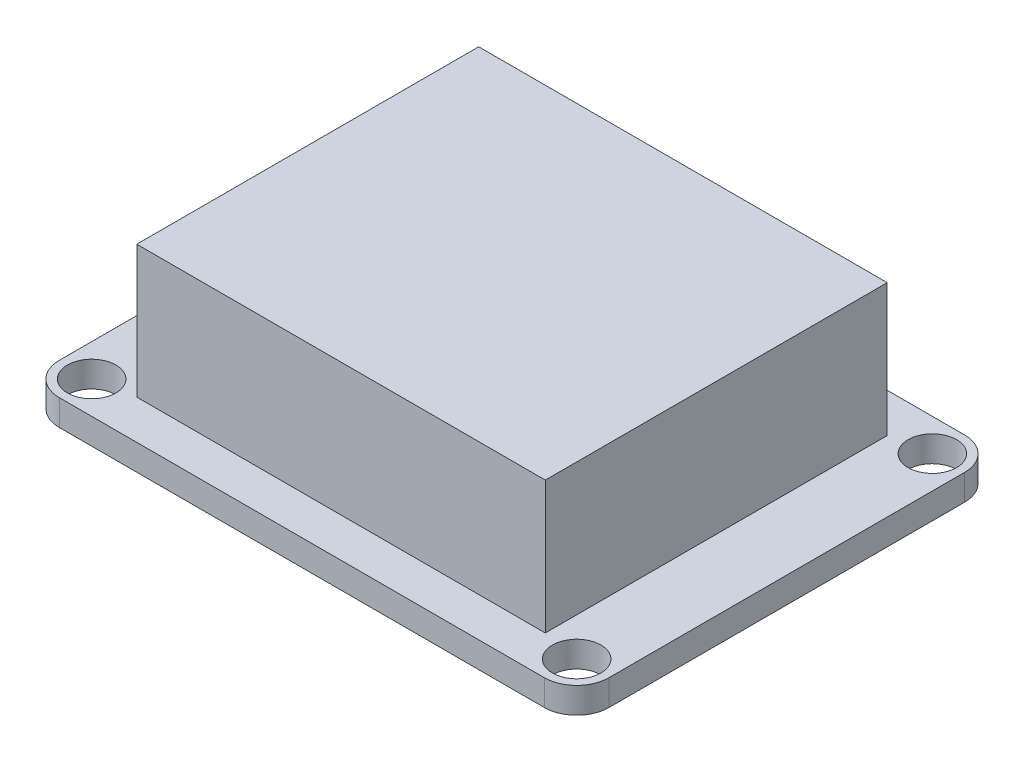
ISO-10303-21;
HEADER;
FILE_DESCRIPTION(('STEP AP214'),'2;1');
FILE_NAME('part.step','',(''),(''),'','','');
FILE_SCHEMA(('AUTOMOTIVE_DESIGN { 1 0 10303 214 1 1 1 1 }'));
ENDSEC;
DATA;
#1=APPLICATION_CONTEXT('core data for automotive mechanical design processes');
#2=APPLICATION_PROTOCOL_DEFINITION('international standard','automotive_design',2000,#1);
#3=PRODUCT_CONTEXT('',#1,'mechanical');
#4=PRODUCT('Part','Part','',(#3));
#5=PRODUCT_RELATED_PRODUCT_CATEGORY('part','',(#4));
#6=PRODUCT_DEFINITION_FORMATION('','',#4);
#7=PRODUCT_DEFINITION_CONTEXT('part definition',#1,'design');
#8=PRODUCT_DEFINITION('design','',#6,#7);
#9=PRODUCT_DEFINITION_SHAPE('','',#8);
#10=(LENGTH_UNIT() NAMED_UNIT(*) SI_UNIT(.MILLI.,.METRE.));
#11=(NAMED_UNIT(*) PLANE_ANGLE_UNIT() SI_UNIT($,.RADIAN.));
#12=(NAMED_UNIT(*) SI_UNIT($,.STERADIAN.) SOLID_ANGLE_UNIT());
#13=UNCERTAINTY_MEASURE_WITH_UNIT(LENGTH_MEASURE(1.E-05),#10,'distance_accuracy_value','');
#14=(GEOMETRIC_REPRESENTATION_CONTEXT(3) GLOBAL_UNCERTAINTY_ASSIGNED_CONTEXT((#13)) GLOBAL_UNIT_ASSIGNED_CONTEXT((#10,
#11,#12)) REPRESENTATION_CONTEXT('',''));
#15=CARTESIAN_POINT('',(0.,0.,0.));
#16=DIRECTION('',(0.,0.,1.));
#17=DIRECTION('',(1.,0.,0.));
#18=AXIS2_PLACEMENT_3D('',#15,#16,#17);
#19=CARTESIAN_POINT('',(0.,1.6,0.));
#20=DIRECTION('',(0.,-1.,0.));
#21=DIRECTION('',(0.,0.,-1.));
#22=AXIS2_PLACEMENT_3D('',#19,#20,#21);
#23=PLANE('',#22);
#24=CARTESIAN_POINT('',(-15.,1.6,-11.));
#25=DIRECTION('',(0.,-1.,0.));
#26=DIRECTION('',(0.,0.,-1.));
#27=AXIS2_PLACEMENT_3D('',#24,#25,#26);
#28=CIRCLE('',#27,1.5);
#29=CARTESIAN_POINT('',(-15.,1.6,-12.5));
#30=VERTEX_POINT('',#29);
#31=EDGE_CURVE('E382',#30,#30,#28,.T.);
#32=ORIENTED_EDGE('',*,*,#31,.T.);
#33=EDGE_LOOP('',(#32));
#34=FACE_BOUND('',#33,.T.);
#35=CARTESIAN_POINT('',(-15.,1.6,11.));
#36=DIRECTION('',(0.,-1.,0.));
#37=DIRECTION('',(0.,0.,-1.));
#38=AXIS2_PLACEMENT_3D('',#35,#36,#37);
#39=CIRCLE('',#38,1.5);
#40=CARTESIAN_POINT('',(-15.,1.6,9.50000000000001));
#41=VERTEX_POINT('',#40);
#42=EDGE_CURVE('E383',#41,#41,#39,.T.);
#43=ORIENTED_EDGE('',*,*,#42,.T.);
#44=EDGE_LOOP('',(#43));
#45=FACE_BOUND('',#44,.T.);
#46=CARTESIAN_POINT('',(15.,1.6,11.));
#47=DIRECTION('',(0.,-1.,0.));
#48=DIRECTION('',(0.,0.,-1.));
#49=AXIS2_PLACEMENT_3D('',#46,#47,#48);
#50=CIRCLE('',#49,1.5);
#51=CARTESIAN_POINT('',(15.,1.6,9.50000000000001));
#52=VERTEX_POINT('',#51);
#53=EDGE_CURVE('E388',#52,#52,#50,.T.);
#54=ORIENTED_EDGE('',*,*,#53,.T.);
#55=EDGE_LOOP('',(#54));
#56=FACE_BOUND('',#55,.T.);
#57=CARTESIAN_POINT('',(15.,1.6,-11.));
#58=DIRECTION('',(0.,-1.,0.));
#59=DIRECTION('',(0.,0.,-1.));
#60=AXIS2_PLACEMENT_3D('',#57,#58,#59);
#61=CIRCLE('',#60,1.5);
#62=CARTESIAN_POINT('',(15.,1.6,-12.5));
#63=VERTEX_POINT('',#62);
#64=EDGE_CURVE('E403',#63,#63,#61,.T.);
#65=ORIENTED_EDGE('',*,*,#64,.T.);
#66=EDGE_LOOP('',(#65));
#67=FACE_BOUND('',#66,.T.);
#68=DIRECTION('',(0.,0.,-1.));
#69=VECTOR('',#68,1.);
#70=CARTESIAN_POINT('',(17.,1.6,-13.));
#71=LINE('',#70,#69);
#72=CARTESIAN_POINT('',(17.,1.6,11.));
#73=VERTEX_POINT('',#72);
#74=CARTESIAN_POINT('',(17.,1.6,-11.));
#75=VERTEX_POINT('',#74);
#76=EDGE_CURVE('E157',#73,#75,#71,.T.);
#77=ORIENTED_EDGE('',*,*,#76,.T.);
#78=CARTESIAN_POINT('',(15.,1.6,-11.));
#79=DIRECTION('',(0.,-1.,0.));
#80=DIRECTION('',(0.,0.,-1.));
#81=AXIS2_PLACEMENT_3D('',#78,#79,#80);
#82=CIRCLE('',#81,2.);
#83=CARTESIAN_POINT('',(15.,1.6,-13.));
#84=VERTEX_POINT('',#83);
#85=EDGE_CURVE('E194',#75,#84,#82,.F.);
#86=ORIENTED_EDGE('',*,*,#85,.T.);
#87=DIRECTION('',(-1.,0.,0.));
#88=VECTOR('',#87,1.);
#89=CARTESIAN_POINT('',(17.,1.6,-13.));
#90=LINE('',#89,#88);
#91=CARTESIAN_POINT('',(-15.,1.6,-13.));
#92=VERTEX_POINT('',#91);
#93=EDGE_CURVE('E160',#84,#92,#90,.T.);
#94=ORIENTED_EDGE('',*,*,#93,.T.);
#95=CARTESIAN_POINT('',(-15.,1.6,-11.));
#96=DIRECTION('',(0.,-1.,0.));
#97=DIRECTION('',(0.,0.,-1.));
#98=AXIS2_PLACEMENT_3D('',#95,#96,#97);
#99=CIRCLE('',#98,2.);
#100=CARTESIAN_POINT('',(-17.,1.6,-11.));
#101=VERTEX_POINT('',#100);
#102=EDGE_CURVE('E188',#92,#101,#99,.F.);
#103=ORIENTED_EDGE('',*,*,#102,.T.);
#104=DIRECTION('',(0.,0.,1.));
#105=VECTOR('',#104,1.);
#106=CARTESIAN_POINT('',(-17.,1.6,-13.));
#107=LINE('',#106,#105);
#108=CARTESIAN_POINT('',(-17.,1.6,11.));
#109=VERTEX_POINT('',#108);
#110=EDGE_CURVE('E150',#101,#109,#107,.T.);
#111=ORIENTED_EDGE('',*,*,#110,.T.);
#112=CARTESIAN_POINT('',(-15.,1.6,11.));
#113=DIRECTION('',(0.,-1.,0.));
#114=DIRECTION('',(0.,0.,-1.));
#115=AXIS2_PLACEMENT_3D('',#112,#113,#114);
#116=CIRCLE('',#115,2.);
#117=CARTESIAN_POINT('',(-15.,1.6,13.));
#118=VERTEX_POINT('',#117);
#119=EDGE_CURVE('E190',#109,#118,#116,.F.);
#120=ORIENTED_EDGE('',*,*,#119,.T.);
#121=DIRECTION('',(1.,0.,0.));
#122=VECTOR('',#121,1.);
#123=CARTESIAN_POINT('',(17.,1.6,13.));
#124=LINE('',#123,#122);
#125=CARTESIAN_POINT('',(15.,1.6,13.));
#126=VERTEX_POINT('',#125);
#127=EDGE_CURVE('E153',#118,#126,#124,.T.);
#128=ORIENTED_EDGE('',*,*,#127,.T.);
#129=CARTESIAN_POINT('',(15.,1.6,11.));
#130=DIRECTION('',(0.,-1.,0.));
#131=DIRECTION('',(0.,0.,-1.));
#132=AXIS2_PLACEMENT_3D('',#129,#130,#131);
#133=CIRCLE('',#132,2.);
#134=EDGE_CURVE('E192',#126,#73,#133,.F.);
#135=ORIENTED_EDGE('',*,*,#134,.T.);
#136=EDGE_LOOP('',(#77,#86,#94,#103,#111,#120,#128,#135));
#137=FACE_BOUND('',#136,.T.);
#138=DIRECTION('',(0.,0.,1.));
#139=VECTOR('',#138,1.);
#140=CARTESIAN_POINT('',(-12.635,1.6,-10.575));
#141=LINE('',#140,#139);
#142=CARTESIAN_POINT('',(-12.635,1.6,-10.575));
#143=VERTEX_POINT('',#142);
#144=CARTESIAN_POINT('',(-12.635,1.6,10.575));
#145=VERTEX_POINT('',#144);
#146=EDGE_CURVE('E48',#143,#145,#141,.T.);
#147=ORIENTED_EDGE('',*,*,#146,.F.);
#148=DIRECTION('',(-1.,0.,0.));
#149=VECTOR('',#148,1.);
#150=CARTESIAN_POINT('',(-12.635,1.6,-10.575));
#151=LINE('',#150,#149);
#152=CARTESIAN_POINT('',(12.635,1.6,-10.575));
#153=VERTEX_POINT('',#152);
#154=EDGE_CURVE('E52',#153,#143,#151,.T.);
#155=ORIENTED_EDGE('',*,*,#154,.F.);
#156=DIRECTION('',(0.,0.,-1.));
#157=VECTOR('',#156,1.);
#158=CARTESIAN_POINT('',(12.635,1.6,-10.575));
#159=LINE('',#158,#157);
#160=CARTESIAN_POINT('',(12.635,1.6,10.575));
#161=VERTEX_POINT('',#160);
#162=EDGE_CURVE('E396',#161,#153,#159,.T.);
#163=ORIENTED_EDGE('',*,*,#162,.F.);
#164=DIRECTION('',(1.,0.,0.));
#165=VECTOR('',#164,1.);
#166=CARTESIAN_POINT('',(-12.635,1.6,10.575));
#167=LINE('',#166,#165);
#168=EDGE_CURVE('E385',#145,#161,#167,.T.);
#169=ORIENTED_EDGE('',*,*,#168,.F.);
#170=EDGE_LOOP('',(#147,#155,#163,#169));
#171=FACE_BOUND('',#170,.T.);
#172=ADVANCED_FACE('F33',(#34,#45,#56,#67,#137,#171),#23,.F.);
#173=CARTESIAN_POINT('',(-17.,1.6,-13.));
#174=DIRECTION('',(1.,0.,0.));
#175=DIRECTION('',(0.,0.,-1.));
#176=AXIS2_PLACEMENT_3D('',#173,#174,#175);
#177=PLANE('',#176);
#178=DIRECTION('',(0.,0.,1.));
#179=VECTOR('',#178,1.);
#180=CARTESIAN_POINT('',(-17.,0.,-13.));
#181=LINE('',#180,#179);
#182=CARTESIAN_POINT('',(-17.,0.,-11.));
#183=VERTEX_POINT('',#182);
#184=CARTESIAN_POINT('',(-17.,0.,11.));
#185=VERTEX_POINT('',#184);
#186=EDGE_CURVE('E141',#183,#185,#181,.T.);
#187=ORIENTED_EDGE('',*,*,#186,.T.);
#188=DIRECTION('',(0.,-1.,0.));
#189=VECTOR('',#188,1.);
#190=CARTESIAN_POINT('',(-17.,1.6,11.));
#191=LINE('',#190,#189);
#192=EDGE_CURVE('E11',#185,#109,#191,.F.);
#193=ORIENTED_EDGE('',*,*,#192,.T.);
#194=ORIENTED_EDGE('',*,*,#110,.F.);
#195=DIRECTION('',(0.,-1.,0.));
#196=VECTOR('',#195,1.);
#197=CARTESIAN_POINT('',(-17.,1.6,-11.));
#198=LINE('',#197,#196);
#199=EDGE_CURVE('E41',#101,#183,#198,.T.);
#200=ORIENTED_EDGE('',*,*,#199,.T.);
#201=EDGE_LOOP('',(#187,#193,#194,#200));
#202=FACE_BOUND('',#201,.T.);
#203=ADVANCED_FACE('F205',(#202),#177,.F.);
#204=CARTESIAN_POINT('',(17.,1.6,13.));
#205=DIRECTION('',(0.,0.,-1.));
#206=DIRECTION('',(-1.,0.,0.));
#207=AXIS2_PLACEMENT_3D('',#204,#205,#206);
#208=PLANE('',#207);
#209=DIRECTION('',(1.,0.,0.));
#210=VECTOR('',#209,1.);
#211=CARTESIAN_POINT('',(17.,0.,13.));
#212=LINE('',#211,#210);
#213=CARTESIAN_POINT('',(-15.,0.,13.));
#214=VERTEX_POINT('',#213);
#215=CARTESIAN_POINT('',(15.,0.,13.));
#216=VERTEX_POINT('',#215);
#217=EDGE_CURVE('E144',#214,#216,#212,.T.);
#218=ORIENTED_EDGE('',*,*,#217,.T.);
#219=DIRECTION('',(0.,-1.,0.));
#220=VECTOR('',#219,1.);
#221=CARTESIAN_POINT('',(15.,1.6,13.));
#222=LINE('',#221,#220);
#223=EDGE_CURVE('E199',#216,#126,#222,.F.);
#224=ORIENTED_EDGE('',*,*,#223,.T.);
#225=ORIENTED_EDGE('',*,*,#127,.F.);
#226=DIRECTION('',(0.,-1.,0.));
#227=VECTOR('',#226,1.);
#228=CARTESIAN_POINT('',(-15.,1.6,13.));
#229=LINE('',#228,#227);
#230=EDGE_CURVE('E196',#118,#214,#229,.T.);
#231=ORIENTED_EDGE('',*,*,#230,.T.);
#232=EDGE_LOOP('',(#218,#224,#225,#231));
#233=FACE_BOUND('',#232,.T.);
#234=ADVANCED_FACE('F219',(#233),#208,.F.);
#235=CARTESIAN_POINT('',(17.,1.6,-13.));
#236=DIRECTION('',(-1.,0.,0.));
#237=DIRECTION('',(0.,0.,1.));
#238=AXIS2_PLACEMENT_3D('',#235,#236,#237);
#239=PLANE('',#238);
#240=DIRECTION('',(0.,0.,-1.));
#241=VECTOR('',#240,1.);
#242=CARTESIAN_POINT('',(17.,0.,-13.));
#243=LINE('',#242,#241);
#244=CARTESIAN_POINT('',(17.,0.,11.));
#245=VERTEX_POINT('',#244);
#246=CARTESIAN_POINT('',(17.,0.,-11.));
#247=VERTEX_POINT('',#246);
#248=EDGE_CURVE('E166',#245,#247,#243,.T.);
#249=ORIENTED_EDGE('',*,*,#248,.T.);
#250=DIRECTION('',(0.,-1.,0.));
#251=VECTOR('',#250,1.);
#252=CARTESIAN_POINT('',(17.,1.6,-11.));
#253=LINE('',#252,#251);
#254=EDGE_CURVE('E186',#247,#75,#253,.F.);
#255=ORIENTED_EDGE('',*,*,#254,.T.);
#256=ORIENTED_EDGE('',*,*,#76,.F.);
#257=DIRECTION('',(0.,-1.,0.));
#258=VECTOR('',#257,1.);
#259=CARTESIAN_POINT('',(17.,1.6,11.));
#260=LINE('',#259,#258);
#261=EDGE_CURVE('E183',#73,#245,#260,.T.);
#262=ORIENTED_EDGE('',*,*,#261,.T.);
#263=EDGE_LOOP('',(#249,#255,#256,#262));
#264=FACE_BOUND('',#263,.T.);
#265=ADVANCED_FACE('F229',(#264),#239,.F.);
#266=CARTESIAN_POINT('',(17.,1.6,-13.));
#267=DIRECTION('',(0.,0.,1.));
#268=DIRECTION('',(1.,0.,0.));
#269=AXIS2_PLACEMENT_3D('',#266,#267,#268);
#270=PLANE('',#269);
#271=ORIENTED_EDGE('',*,*,#93,.F.);
#272=DIRECTION('',(0.,-1.,0.));
#273=VECTOR('',#272,1.);
#274=CARTESIAN_POINT('',(15.,1.6,-13.));
#275=LINE('',#274,#273);
#276=CARTESIAN_POINT('',(15.,0.,-13.));
#277=VERTEX_POINT('',#276);
#278=EDGE_CURVE('E172',#84,#277,#275,.T.);
#279=ORIENTED_EDGE('',*,*,#278,.T.);
#280=DIRECTION('',(-1.,0.,0.));
#281=VECTOR('',#280,1.);
#282=CARTESIAN_POINT('',(17.,0.,-13.));
#283=LINE('',#282,#281);
#284=CARTESIAN_POINT('',(-15.,0.,-13.));
#285=VERTEX_POINT('',#284);
#286=EDGE_CURVE('E154',#277,#285,#283,.T.);
#287=ORIENTED_EDGE('',*,*,#286,.T.);
#288=DIRECTION('',(0.,-1.,0.));
#289=VECTOR('',#288,1.);
#290=CARTESIAN_POINT('',(-15.,1.6,-13.));
#291=LINE('',#290,#289);
#292=EDGE_CURVE('E162',#285,#92,#291,.F.);
#293=ORIENTED_EDGE('',*,*,#292,.T.);
#294=EDGE_LOOP('',(#271,#279,#287,#293));
#295=FACE_BOUND('',#294,.T.);
#296=ADVANCED_FACE('F237',(#295),#270,.F.);
#297=CARTESIAN_POINT('',(0.,0.,0.));
#298=DIRECTION('',(0.,-1.,0.));
#299=DIRECTION('',(0.,0.,-1.));
#300=AXIS2_PLACEMENT_3D('',#297,#298,#299);
#301=PLANE('',#300);
#302=CARTESIAN_POINT('',(-15.,0.,-11.));
#303=DIRECTION('',(0.,1.,0.));
#304=DIRECTION('',(0.,0.,1.));
#305=AXIS2_PLACEMENT_3D('',#302,#303,#304);
#306=CIRCLE('',#305,1.5);
#307=CARTESIAN_POINT('',(-15.,0.,-9.5));
#308=VERTEX_POINT('',#307);
#309=EDGE_CURVE('E380',#308,#308,#306,.T.);
#310=ORIENTED_EDGE('',*,*,#309,.T.);
#311=EDGE_LOOP('',(#310));
#312=FACE_BOUND('',#311,.T.);
#313=CARTESIAN_POINT('',(-15.,0.,11.));
#314=DIRECTION('',(0.,1.,0.));
#315=DIRECTION('',(0.,0.,1.));
#316=AXIS2_PLACEMENT_3D('',#313,#314,#315);
#317=CIRCLE('',#316,1.5);
#318=CARTESIAN_POINT('',(-15.,0.,12.5));
#319=VERTEX_POINT('',#318);
#320=EDGE_CURVE('E411',#319,#319,#317,.T.);
#321=ORIENTED_EDGE('',*,*,#320,.T.);
#322=EDGE_LOOP('',(#321));
#323=FACE_BOUND('',#322,.T.);
#324=CARTESIAN_POINT('',(15.,0.,11.));
#325=DIRECTION('',(0.,1.,0.));
#326=DIRECTION('',(0.,0.,1.));
#327=AXIS2_PLACEMENT_3D('',#324,#325,#326);
#328=CIRCLE('',#327,1.5);
#329=CARTESIAN_POINT('',(15.,0.,12.5));
#330=VERTEX_POINT('',#329);
#331=EDGE_CURVE('E409',#330,#330,#328,.T.);
#332=ORIENTED_EDGE('',*,*,#331,.T.);
#333=EDGE_LOOP('',(#332));
#334=FACE_BOUND('',#333,.T.);
#335=CARTESIAN_POINT('',(15.,0.,-11.));
#336=DIRECTION('',(0.,1.,0.));
#337=DIRECTION('',(0.,0.,1.));
#338=AXIS2_PLACEMENT_3D('',#335,#336,#337);
#339=CIRCLE('',#338,1.5);
#340=CARTESIAN_POINT('',(15.,0.,-9.5));
#341=VERTEX_POINT('',#340);
#342=EDGE_CURVE('E406',#341,#341,#339,.T.);
#343=ORIENTED_EDGE('',*,*,#342,.T.);
#344=EDGE_LOOP('',(#343));
#345=FACE_BOUND('',#344,.T.);
#346=ORIENTED_EDGE('',*,*,#286,.F.);
#347=CARTESIAN_POINT('',(15.,0.,-11.));
#348=DIRECTION('',(0.,-1.,0.));
#349=DIRECTION('',(0.,0.,-1.));
#350=AXIS2_PLACEMENT_3D('',#347,#348,#349);
#351=CIRCLE('',#350,2.);
#352=EDGE_CURVE('E181',#277,#247,#351,.T.);
#353=ORIENTED_EDGE('',*,*,#352,.T.);
#354=ORIENTED_EDGE('',*,*,#248,.F.);
#355=CARTESIAN_POINT('',(15.,0.,11.));
#356=DIRECTION('',(0.,-1.,0.));
#357=DIRECTION('',(0.,0.,-1.));
#358=AXIS2_PLACEMENT_3D('',#355,#356,#357);
#359=CIRCLE('',#358,2.);
#360=EDGE_CURVE('E179',#245,#216,#359,.T.);
#361=ORIENTED_EDGE('',*,*,#360,.T.);
#362=ORIENTED_EDGE('',*,*,#217,.F.);
#363=CARTESIAN_POINT('',(-15.,0.,11.));
#364=DIRECTION('',(0.,-1.,0.));
#365=DIRECTION('',(0.,0.,-1.));
#366=AXIS2_PLACEMENT_3D('',#363,#364,#365);
#367=CIRCLE('',#366,2.);
#368=EDGE_CURVE('E177',#214,#185,#367,.T.);
#369=ORIENTED_EDGE('',*,*,#368,.T.);
#370=ORIENTED_EDGE('',*,*,#186,.F.);
#371=CARTESIAN_POINT('',(-15.,0.,-11.));
#372=DIRECTION('',(0.,-1.,0.));
#373=DIRECTION('',(0.,0.,-1.));
#374=AXIS2_PLACEMENT_3D('',#371,#372,#373);
#375=CIRCLE('',#374,2.);
#376=EDGE_CURVE('E175',#183,#285,#375,.T.);
#377=ORIENTED_EDGE('',*,*,#376,.T.);
#378=EDGE_LOOP('',(#346,#353,#354,#361,#362,#369,#370,#377));
#379=FACE_BOUND('',#378,.T.);
#380=ADVANCED_FACE('F211',(#312,#323,#334,#345,#379),#301,.T.);
#381=CARTESIAN_POINT('',(15.,1.6,-11.));
#382=DIRECTION('',(0.,-1.,0.));
#383=DIRECTION('',(0.,0.,-1.));
#384=AXIS2_PLACEMENT_3D('',#381,#382,#383);
#385=CYLINDRICAL_SURFACE('',#384,2.);
#386=ORIENTED_EDGE('',*,*,#85,.F.);
#387=ORIENTED_EDGE('',*,*,#254,.F.);
#388=ORIENTED_EDGE('',*,*,#352,.F.);
#389=ORIENTED_EDGE('',*,*,#278,.F.);
#390=EDGE_LOOP('',(#386,#387,#388,#389));
#391=FACE_BOUND('',#390,.T.);
#392=ADVANCED_FACE('F234',(#391),#385,.T.);
#393=CARTESIAN_POINT('',(15.,1.6,11.));
#394=DIRECTION('',(0.,-1.,0.));
#395=DIRECTION('',(0.,0.,-1.));
#396=AXIS2_PLACEMENT_3D('',#393,#394,#395);
#397=CYLINDRICAL_SURFACE('',#396,2.);
#398=ORIENTED_EDGE('',*,*,#134,.F.);
#399=ORIENTED_EDGE('',*,*,#223,.F.);
#400=ORIENTED_EDGE('',*,*,#360,.F.);
#401=ORIENTED_EDGE('',*,*,#261,.F.);
#402=EDGE_LOOP('',(#398,#399,#400,#401));
#403=FACE_BOUND('',#402,.T.);
#404=ADVANCED_FACE('F226',(#403),#397,.T.);
#405=CARTESIAN_POINT('',(-15.,1.6,11.));
#406=DIRECTION('',(0.,-1.,0.));
#407=DIRECTION('',(0.,0.,-1.));
#408=AXIS2_PLACEMENT_3D('',#405,#406,#407);
#409=CYLINDRICAL_SURFACE('',#408,2.);
#410=ORIENTED_EDGE('',*,*,#119,.F.);
#411=ORIENTED_EDGE('',*,*,#192,.F.);
#412=ORIENTED_EDGE('',*,*,#368,.F.);
#413=ORIENTED_EDGE('',*,*,#230,.F.);
#414=EDGE_LOOP('',(#410,#411,#412,#413));
#415=FACE_BOUND('',#414,.T.);
#416=ADVANCED_FACE('F216',(#415),#409,.T.);
#417=CARTESIAN_POINT('',(-15.,1.6,-11.));
#418=DIRECTION('',(0.,-1.,0.));
#419=DIRECTION('',(0.,0.,-1.));
#420=AXIS2_PLACEMENT_3D('',#417,#418,#419);
#421=CYLINDRICAL_SURFACE('',#420,2.);
#422=ORIENTED_EDGE('',*,*,#102,.F.);
#423=ORIENTED_EDGE('',*,*,#292,.F.);
#424=ORIENTED_EDGE('',*,*,#376,.F.);
#425=ORIENTED_EDGE('',*,*,#199,.F.);
#426=EDGE_LOOP('',(#422,#423,#424,#425));
#427=FACE_BOUND('',#426,.T.);
#428=ADVANCED_FACE('F35',(#427),#421,.T.);
#429=CARTESIAN_POINT('',(-12.635,9.79,-10.575));
#430=DIRECTION('',(1.,0.,0.));
#431=DIRECTION('',(0.,0.,-1.));
#432=AXIS2_PLACEMENT_3D('',#429,#430,#431);
#433=PLANE('',#432);
#434=ORIENTED_EDGE('',*,*,#146,.T.);
#435=DIRECTION('',(0.,-1.,0.));
#436=VECTOR('',#435,1.);
#437=CARTESIAN_POINT('',(-12.635,9.79,10.575));
#438=LINE('',#437,#436);
#439=CARTESIAN_POINT('',(-12.635,9.79,10.575));
#440=VERTEX_POINT('',#439);
#441=EDGE_CURVE('E124',#440,#145,#438,.T.);
#442=ORIENTED_EDGE('',*,*,#441,.F.);
#443=DIRECTION('',(0.,0.,1.));
#444=VECTOR('',#443,1.);
#445=CARTESIAN_POINT('',(-12.635,9.79,-10.575));
#446=LINE('',#445,#444);
#447=CARTESIAN_POINT('',(-12.635,9.79,-10.575));
#448=VERTEX_POINT('',#447);
#449=EDGE_CURVE('E130',#448,#440,#446,.T.);
#450=ORIENTED_EDGE('',*,*,#449,.F.);
#451=DIRECTION('',(0.,-1.,0.));
#452=VECTOR('',#451,1.);
#453=CARTESIAN_POINT('',(-12.635,9.79,-10.575));
#454=LINE('',#453,#452);
#455=EDGE_CURVE('E393',#448,#143,#454,.T.);
#456=ORIENTED_EDGE('',*,*,#455,.T.);
#457=EDGE_LOOP('',(#434,#442,#450,#456));
#458=FACE_BOUND('',#457,.T.);
#459=ADVANCED_FACE('F140',(#458),#433,.F.);
#460=CARTESIAN_POINT('',(-12.635,9.79,10.575));
#461=DIRECTION('',(0.,0.,-1.));
#462=DIRECTION('',(-1.,0.,0.));
#463=AXIS2_PLACEMENT_3D('',#460,#461,#462);
#464=PLANE('',#463);
#465=ORIENTED_EDGE('',*,*,#168,.T.);
#466=DIRECTION('',(0.,-1.,0.));
#467=VECTOR('',#466,1.);
#468=CARTESIAN_POINT('',(12.635,9.79,10.575));
#469=LINE('',#468,#467);
#470=CARTESIAN_POINT('',(12.635,9.79,10.575));
#471=VERTEX_POINT('',#470);
#472=EDGE_CURVE('E126',#471,#161,#469,.T.);
#473=ORIENTED_EDGE('',*,*,#472,.F.);
#474=DIRECTION('',(1.,0.,0.));
#475=VECTOR('',#474,1.);
#476=CARTESIAN_POINT('',(-12.635,9.79,10.575));
#477=LINE('',#476,#475);
#478=EDGE_CURVE('E119',#440,#471,#477,.T.);
#479=ORIENTED_EDGE('',*,*,#478,.F.);
#480=ORIENTED_EDGE('',*,*,#441,.T.);
#481=EDGE_LOOP('',(#465,#473,#479,#480));
#482=FACE_BOUND('',#481,.T.);
#483=ADVANCED_FACE('F122',(#482),#464,.F.);
#484=CARTESIAN_POINT('',(12.635,9.79,-10.575));
#485=DIRECTION('',(-1.,0.,0.));
#486=DIRECTION('',(0.,0.,1.));
#487=AXIS2_PLACEMENT_3D('',#484,#485,#486);
#488=PLANE('',#487);
#489=ORIENTED_EDGE('',*,*,#162,.T.);
#490=DIRECTION('',(0.,-1.,0.));
#491=VECTOR('',#490,1.);
#492=CARTESIAN_POINT('',(12.635,9.79,-10.575));
#493=LINE('',#492,#491);
#494=CARTESIAN_POINT('',(12.635,9.79,-10.575));
#495=VERTEX_POINT('',#494);
#496=EDGE_CURVE('E146',#495,#153,#493,.T.);
#497=ORIENTED_EDGE('',*,*,#496,.F.);
#498=DIRECTION('',(0.,0.,-1.));
#499=VECTOR('',#498,1.);
#500=CARTESIAN_POINT('',(12.635,9.79,-10.575));
#501=LINE('',#500,#499);
#502=EDGE_CURVE('E129',#471,#495,#501,.T.);
#503=ORIENTED_EDGE('',*,*,#502,.F.);
#504=ORIENTED_EDGE('',*,*,#472,.T.);
#505=EDGE_LOOP('',(#489,#497,#503,#504));
#506=FACE_BOUND('',#505,.T.);
#507=ADVANCED_FACE('F296',(#506),#488,.F.);
#508=CARTESIAN_POINT('',(-12.635,9.79,-10.575));
#509=DIRECTION('',(0.,0.,1.));
#510=DIRECTION('',(1.,0.,0.));
#511=AXIS2_PLACEMENT_3D('',#508,#509,#510);
#512=PLANE('',#511);
#513=ORIENTED_EDGE('',*,*,#154,.T.);
#514=ORIENTED_EDGE('',*,*,#455,.F.);
#515=DIRECTION('',(-1.,0.,0.));
#516=VECTOR('',#515,1.);
#517=CARTESIAN_POINT('',(-12.635,9.79,-10.575));
#518=LINE('',#517,#516);
#519=EDGE_CURVE('E135',#495,#448,#518,.T.);
#520=ORIENTED_EDGE('',*,*,#519,.F.);
#521=ORIENTED_EDGE('',*,*,#496,.T.);
#522=EDGE_LOOP('',(#513,#514,#520,#521));
#523=FACE_BOUND('',#522,.T.);
#524=ADVANCED_FACE('F304',(#523),#512,.F.);
#525=CARTESIAN_POINT('',(0.,9.79,0.));
#526=DIRECTION('',(0.,1.,0.));
#527=DIRECTION('',(0.,0.,1.));
#528=AXIS2_PLACEMENT_3D('',#525,#526,#527);
#529=PLANE('',#528);
#530=ORIENTED_EDGE('',*,*,#449,.T.);
#531=ORIENTED_EDGE('',*,*,#478,.T.);
#532=ORIENTED_EDGE('',*,*,#502,.T.);
#533=ORIENTED_EDGE('',*,*,#519,.T.);
#534=EDGE_LOOP('',(#530,#531,#532,#533));
#535=FACE_BOUND('',#534,.T.);
#536=ADVANCED_FACE('F133',(#535),#529,.T.);
#537=CARTESIAN_POINT('',(15.,0.,-11.));
#538=DIRECTION('',(0.,1.,0.));
#539=DIRECTION('',(0.,0.,1.));
#540=AXIS2_PLACEMENT_3D('',#537,#538,#539);
#541=CYLINDRICAL_SURFACE('',#540,1.5);
#542=ORIENTED_EDGE('',*,*,#342,.F.);
#543=EDGE_LOOP('',(#542));
#544=FACE_BOUND('',#543,.T.);
#545=ORIENTED_EDGE('',*,*,#64,.F.);
#546=EDGE_LOOP('',(#545));
#547=FACE_BOUND('',#546,.T.);
#548=ADVANCED_FACE('F322',(#544,#547),#541,.F.);
#549=CARTESIAN_POINT('',(15.,0.,11.));
#550=DIRECTION('',(0.,1.,0.));
#551=DIRECTION('',(0.,0.,1.));
#552=AXIS2_PLACEMENT_3D('',#549,#550,#551);
#553=CYLINDRICAL_SURFACE('',#552,1.5);
#554=ORIENTED_EDGE('',*,*,#331,.F.);
#555=EDGE_LOOP('',(#554));
#556=FACE_BOUND('',#555,.T.);
#557=ORIENTED_EDGE('',*,*,#53,.F.);
#558=EDGE_LOOP('',(#557));
#559=FACE_BOUND('',#558,.T.);
#560=ADVANCED_FACE('F343',(#556,#559),#553,.F.);
#561=CARTESIAN_POINT('',(-15.,0.,11.));
#562=DIRECTION('',(0.,1.,0.));
#563=DIRECTION('',(0.,0.,1.));
#564=AXIS2_PLACEMENT_3D('',#561,#562,#563);
#565=CYLINDRICAL_SURFACE('',#564,1.5);
#566=ORIENTED_EDGE('',*,*,#320,.F.);
#567=EDGE_LOOP('',(#566));
#568=FACE_BOUND('',#567,.T.);
#569=ORIENTED_EDGE('',*,*,#42,.F.);
#570=EDGE_LOOP('',(#569));
#571=FACE_BOUND('',#570,.T.);
#572=ADVANCED_FACE('F353',(#568,#571),#565,.F.);
#573=CARTESIAN_POINT('',(-15.,0.,-11.));
#574=DIRECTION('',(0.,1.,0.));
#575=DIRECTION('',(0.,0.,1.));
#576=AXIS2_PLACEMENT_3D('',#573,#574,#575);
#577=CYLINDRICAL_SURFACE('',#576,1.5);
#578=ORIENTED_EDGE('',*,*,#309,.F.);
#579=EDGE_LOOP('',(#578));
#580=FACE_BOUND('',#579,.T.);
#581=ORIENTED_EDGE('',*,*,#31,.F.);
#582=EDGE_LOOP('',(#581));
#583=FACE_BOUND('',#582,.T.);
#584=ADVANCED_FACE('F363',(#580,#583),#577,.F.);
#585=CLOSED_SHELL('',(#172,#203,#234,#265,#296,#380,#392,#404,#416,#428,#459,#483,#507,#524,
#536,#548,#560,#572,#584));
#586=MANIFOLD_SOLID_BREP('B2',#585);
#587=ADVANCED_BREP_SHAPE_REPRESENTATION('',(#18,#586),#14);
#588=SHAPE_DEFINITION_REPRESENTATION(#9,#587);
ENDSEC;
END-ISO-10303-21;
